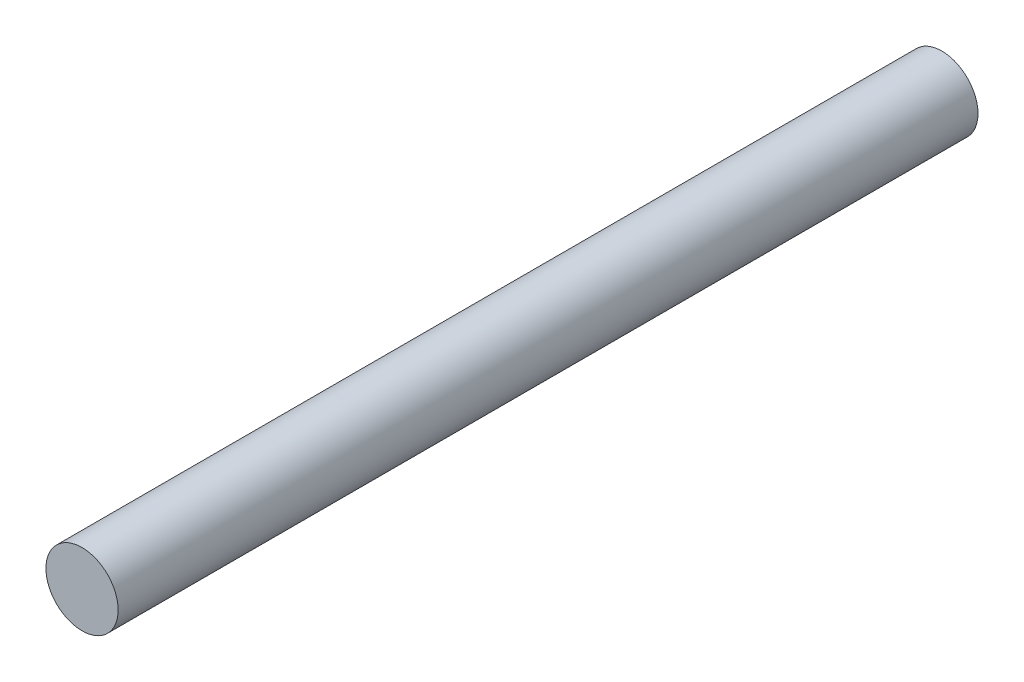
ISO-10303-21;
HEADER;
FILE_DESCRIPTION(('STEP AP214'),'2;1');
FILE_NAME('part.step','',(''),(''),'','','');
FILE_SCHEMA(('AUTOMOTIVE_DESIGN { 1 0 10303 214 1 1 1 1 }'));
ENDSEC;
DATA;
#1=APPLICATION_CONTEXT('core data for automotive mechanical design processes');
#2=APPLICATION_PROTOCOL_DEFINITION('international standard','automotive_design',2000,#1);
#3=PRODUCT_CONTEXT('',#1,'mechanical');
#4=PRODUCT('Part','Part','',(#3));
#5=PRODUCT_RELATED_PRODUCT_CATEGORY('part','',(#4));
#6=PRODUCT_DEFINITION_FORMATION('','',#4);
#7=PRODUCT_DEFINITION_CONTEXT('part definition',#1,'design');
#8=PRODUCT_DEFINITION('design','',#6,#7);
#9=PRODUCT_DEFINITION_SHAPE('','',#8);
#10=(LENGTH_UNIT() NAMED_UNIT(*) SI_UNIT(.MILLI.,.METRE.));
#11=(NAMED_UNIT(*) PLANE_ANGLE_UNIT() SI_UNIT($,.RADIAN.));
#12=(NAMED_UNIT(*) SI_UNIT($,.STERADIAN.) SOLID_ANGLE_UNIT());
#13=UNCERTAINTY_MEASURE_WITH_UNIT(LENGTH_MEASURE(1.E-05),#10,'distance_accuracy_value','');
#14=(GEOMETRIC_REPRESENTATION_CONTEXT(3) GLOBAL_UNCERTAINTY_ASSIGNED_CONTEXT((#13)) GLOBAL_UNIT_ASSIGNED_CONTEXT((#10,
#11,#12)) REPRESENTATION_CONTEXT('',''));
#15=CARTESIAN_POINT('',(0.,0.,0.));
#16=DIRECTION('',(0.,0.,1.));
#17=DIRECTION('',(1.,0.,0.));
#18=AXIS2_PLACEMENT_3D('',#15,#16,#17);
#19=CARTESIAN_POINT('',(0.,0.,147.7));
#20=DIRECTION('',(0.,0.,-1.));
#21=DIRECTION('',(-1.,0.,0.));
#22=AXIS2_PLACEMENT_3D('',#19,#20,#21);
#23=CYLINDRICAL_SURFACE('',#22,6.2);
#24=CARTESIAN_POINT('',(0.,0.,147.7));
#25=DIRECTION('',(0.,0.,1.));
#26=DIRECTION('',(1.,0.,0.));
#27=AXIS2_PLACEMENT_3D('',#24,#25,#26);
#28=CIRCLE('',#27,6.2);
#29=CARTESIAN_POINT('',(6.2,0.,147.7));
#30=VERTEX_POINT('',#29);
#31=EDGE_CURVE('E10',#30,#30,#28,.T.);
#32=ORIENTED_EDGE('',*,*,#31,.F.);
#33=EDGE_LOOP('',(#32));
#34=FACE_BOUND('',#33,.T.);
#35=CARTESIAN_POINT('',(0.,0.,0.));
#36=DIRECTION('',(0.,0.,1.));
#37=DIRECTION('',(1.,0.,0.));
#38=AXIS2_PLACEMENT_3D('',#35,#36,#37);
#39=CIRCLE('',#38,6.2);
#40=CARTESIAN_POINT('',(6.2,0.,0.));
#41=VERTEX_POINT('',#40);
#42=EDGE_CURVE('E33',#41,#41,#39,.T.);
#43=ORIENTED_EDGE('',*,*,#42,.T.);
#44=EDGE_LOOP('',(#43));
#45=FACE_BOUND('',#44,.T.);
#46=ADVANCED_FACE('F30',(#34,#45),#23,.T.);
#47=CARTESIAN_POINT('',(0.,0.,147.7));
#48=DIRECTION('',(0.,0.,1.));
#49=DIRECTION('',(1.,0.,0.));
#50=AXIS2_PLACEMENT_3D('',#47,#48,#49);
#51=PLANE('',#50);
#52=ORIENTED_EDGE('',*,*,#31,.T.);
#53=EDGE_LOOP('',(#52));
#54=FACE_BOUND('',#53,.T.);
#55=ADVANCED_FACE('F45',(#54),#51,.T.);
#56=CARTESIAN_POINT('',(0.,0.,0.));
#57=DIRECTION('',(0.,0.,1.));
#58=DIRECTION('',(1.,0.,0.));
#59=AXIS2_PLACEMENT_3D('',#56,#57,#58);
#60=PLANE('',#59);
#61=ORIENTED_EDGE('',*,*,#42,.F.);
#62=EDGE_LOOP('',(#61));
#63=FACE_BOUND('',#62,.T.);
#64=ADVANCED_FACE('F43',(#63),#60,.F.);
#65=CLOSED_SHELL('',(#46,#55,#64));
#66=MANIFOLD_SOLID_BREP('B2',#65);
#67=ADVANCED_BREP_SHAPE_REPRESENTATION('',(#18,#66),#14);
#68=SHAPE_DEFINITION_REPRESENTATION(#9,#67);
ENDSEC;
END-ISO-10303-21;
